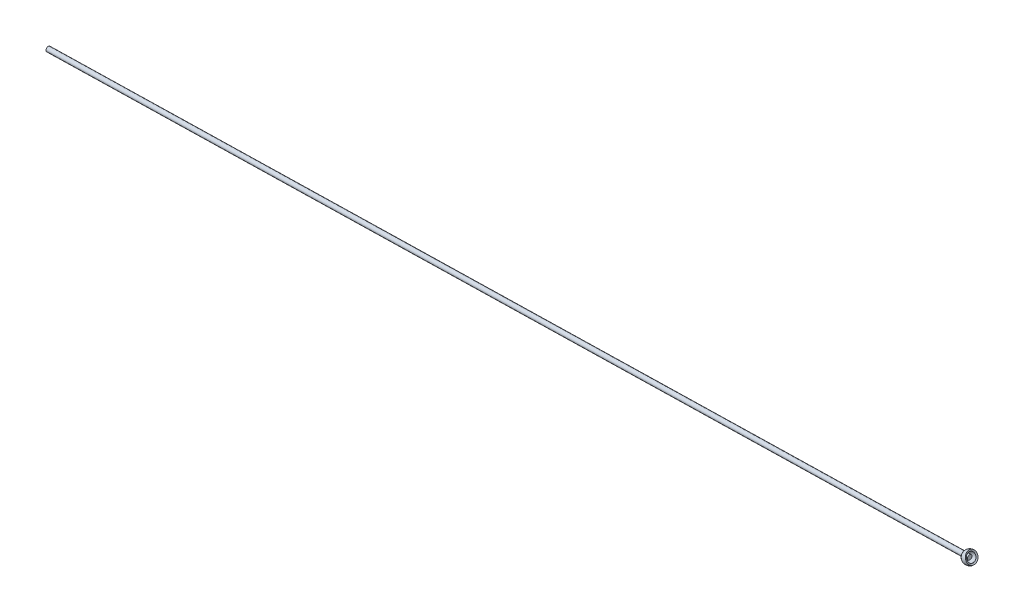
ISO-10303-21;
HEADER;
FILE_DESCRIPTION(('STEP AP214'),'2;1');
FILE_NAME('part.step','',(''),(''),'','','');
FILE_SCHEMA(('AUTOMOTIVE_DESIGN { 1 0 10303 214 1 1 1 1 }'));
ENDSEC;
DATA;
#1=APPLICATION_CONTEXT('core data for automotive mechanical design processes');
#2=APPLICATION_PROTOCOL_DEFINITION('international standard','automotive_design',2000,#1);
#3=PRODUCT_CONTEXT('',#1,'mechanical');
#4=PRODUCT('Part','Part','',(#3));
#5=PRODUCT_RELATED_PRODUCT_CATEGORY('part','',(#4));
#6=PRODUCT_DEFINITION_FORMATION('','',#4);
#7=PRODUCT_DEFINITION_CONTEXT('part definition',#1,'design');
#8=PRODUCT_DEFINITION('design','',#6,#7);
#9=PRODUCT_DEFINITION_SHAPE('','',#8);
#10=(LENGTH_UNIT() NAMED_UNIT(*) SI_UNIT(.MILLI.,.METRE.));
#11=(NAMED_UNIT(*) PLANE_ANGLE_UNIT() SI_UNIT($,.RADIAN.));
#12=(NAMED_UNIT(*) SI_UNIT($,.STERADIAN.) SOLID_ANGLE_UNIT());
#13=UNCERTAINTY_MEASURE_WITH_UNIT(LENGTH_MEASURE(1.E-05),#10,'distance_accuracy_value','');
#14=(GEOMETRIC_REPRESENTATION_CONTEXT(3) GLOBAL_UNCERTAINTY_ASSIGNED_CONTEXT((#13)) GLOBAL_UNIT_ASSIGNED_CONTEXT((#10,
#11,#12)) REPRESENTATION_CONTEXT('',''));
#15=CARTESIAN_POINT('',(0.,0.,0.));
#16=DIRECTION('',(0.,0.,1.));
#17=DIRECTION('',(1.,0.,0.));
#18=AXIS2_PLACEMENT_3D('',#15,#16,#17);
#19=CARTESIAN_POINT('',(-891.012132466336,-167.723171854047,0.));
#20=DIRECTION('',(0.999750901456538,0.0223189389720974,0.));
#21=DIRECTION('',(-0.0223189389720974,0.999750901456538,0.));
#22=AXIS2_PLACEMENT_3D('',#19,#20,#21);
#23=CYLINDRICAL_SURFACE('',#22,1.5);
#24=CARTESIAN_POINT('',(-891.012132466336,-167.723171854047,0.));
#25=DIRECTION('',(0.999750901456538,0.0223189389720974,0.));
#26=DIRECTION('',(-0.0223189389720974,0.999750901456538,0.));
#27=AXIS2_PLACEMENT_3D('',#24,#25,#26);
#28=CIRCLE('',#27,1.5);
#29=CARTESIAN_POINT('',(-891.045610874794,-166.223545501862,0.));
#30=VERTEX_POINT('',#29);
#31=EDGE_CURVE('E39',#30,#30,#28,.T.);
#32=ORIENTED_EDGE('',*,*,#31,.T.);
#33=EDGE_LOOP('',(#32));
#34=FACE_BOUND('',#33,.T.);
#35=CARTESIAN_POINT('',(-294.868767153841,-154.414569311508,0.));
#36=DIRECTION('',(0.999750901456541,0.0223189389720994,0.));
#37=DIRECTION('',(-0.0223189389720993,0.999750901456538,0.));
#38=AXIS2_PLACEMENT_3D('',#35,#36,#37);
#39=CIRCLE('',#38,1.5);
#40=CARTESIAN_POINT('',(-294.902245562299,-152.914942959323,0.));
#41=VERTEX_POINT('',#40);
#42=EDGE_CURVE('E35',#41,#41,#39,.F.);
#43=ORIENTED_EDGE('',*,*,#42,.T.);
#44=EDGE_LOOP('',(#43));
#45=FACE_BOUND('',#44,.T.);
#46=ADVANCED_FACE('F31',(#34,#45),#23,.T.);
#47=CARTESIAN_POINT('',(-891.012132466336,-167.723171854047,0.));
#48=DIRECTION('',(0.999750901456538,0.0223189389720974,0.));
#49=DIRECTION('',(-0.0223189389720974,0.999750901456538,0.));
#50=AXIS2_PLACEMENT_3D('',#47,#48,#49);
#51=PLANE('',#50);
#52=ORIENTED_EDGE('',*,*,#31,.F.);
#53=EDGE_LOOP('',(#52));
#54=FACE_BOUND('',#53,.T.);
#55=ADVANCED_FACE('F70',(#54),#51,.F.);
#56=CARTESIAN_POINT('',(-291.161591592414,-154.331808470789,0.));
#57=DIRECTION('',(-0.892973188253534,-0.450109858879273,0.));
#58=DIRECTION('',(-0.450109858879273,0.892973188253534,0.));
#59=AXIS2_PLACEMENT_3D('',#56,#57,#58);
#60=SPHERICAL_SURFACE('',#59,3.99999999999998);
#61=ORIENTED_EDGE('',*,*,#42,.F.);
#62=EDGE_LOOP('',(#61));
#63=FACE_BOUND('',#62,.T.);
#64=CARTESIAN_POINT('',(-289.939932321084,-153.716021917004,0.));
#65=DIRECTION('',(-0.892973188253534,-0.450109858879273,0.));
#66=DIRECTION('',(0.450109858879273,-0.892973188253534,0.));
#67=AXIS2_PLACEMENT_3D('',#64,#65,#66);
#68=CIRCLE('',#67,3.75877048314366);
#69=CARTESIAN_POINT('',(-291.631791972811,-150.359540654758,0.));
#70=VERTEX_POINT('',#69);
#71=EDGE_CURVE('E51',#70,#70,#68,.T.);
#72=ORIENTED_EDGE('',*,*,#71,.T.);
#73=EDGE_LOOP('',(#72));
#74=FACE_BOUND('',#73,.T.);
#75=ADVANCED_FACE('F55',(#63,#74),#60,.T.);
#76=CARTESIAN_POINT('',(-291.161591592414,-154.331808470789,0.));
#77=DIRECTION('',(-0.892973188253534,-0.450109858879273,0.));
#78=DIRECTION('',(-0.450109858879273,0.892973188253534,0.));
#79=AXIS2_PLACEMENT_3D('',#76,#77,#78);
#80=SPHERICAL_SURFACE('',#79,2.99999999999998);
#81=CARTESIAN_POINT('',(-293.759020626767,-154.389794775195,0.));
#82=DIRECTION('',(0.999750901456531,0.0223189389721026,0.));
#83=DIRECTION('',(-0.0223189389721028,0.999750901456538,0.));
#84=AXIS2_PLACEMENT_3D('',#81,#82,#83);
#85=CIRCLE('',#84,1.5);
#86=CARTESIAN_POINT('',(-293.792499035225,-152.89016842301,0.));
#87=VERTEX_POINT('',#86);
#88=EDGE_CURVE('E10',#87,#87,#85,.F.);
#89=CARTESIAN_POINT('',(-290.245347138916,-153.86996855545,0.));
#90=DIRECTION('',(-0.892973188253534,-0.450109858879273,0.));
#91=DIRECTION('',(0.450109858879273,-0.892973188253534,0.));
#92=AXIS2_PLACEMENT_3D('',#89,#90,#91);
#93=CIRCLE('',#92,2.81907786235773);
#94=CARTESIAN_POINT('',(-291.514241877712,-151.352607608765,0.));
#95=VERTEX_POINT('',#94);
#96=EDGE_CURVE('E48',#95,#95,#93,.T.);
#97=CARTESIAN_POINT('',(-293.792499035225,-152.89016842301,0.));
#98=CARTESIAN_POINT('',(-293.778207460315,-152.864086855634,0.));
#99=CARTESIAN_POINT('',(-293.763527808711,-152.838217948194,0.));
#100=CARTESIAN_POINT('',(-293.733405867227,-152.786928020059,0.));
#101=CARTESIAN_POINT('',(-293.717963577348,-152.761506999363,0.));
#102=CARTESIAN_POINT('',(-293.686329874428,-152.711135411587,0.));
#103=CARTESIAN_POINT('',(-293.670138461388,-152.686184844507,0.));
#104=CARTESIAN_POINT('',(-293.63702087054,-152.636776208606,0.));
#105=CARTESIAN_POINT('',(-293.620094692733,-152.612318139786,0.));
#106=CARTESIAN_POINT('',(-293.585522532169,-152.563916137912,0.));
#107=CARTESIAN_POINT('',(-293.567876549412,-152.539972204858,0.));
#108=CARTESIAN_POINT('',(-293.531880388358,-152.492619649681,0.));
#109=CARTESIAN_POINT('',(-293.513530210062,-152.469211027559,0.));
#110=CARTESIAN_POINT('',(-293.476141886678,-152.422949798008,0.));
#111=CARTESIAN_POINT('',(-293.45710374159,-152.40009719058,0.));
#112=CARTESIAN_POINT('',(-293.418356322761,-152.354968201875,0.));
#113=CARTESIAN_POINT('',(-293.39864704902,-152.332691820598,0.));
#114=CARTESIAN_POINT('',(-293.35857480434,-152.288734986169,0.));
#115=CARTESIAN_POINT('',(-293.338211833402,-152.267054533016,0.));
#116=CARTESIAN_POINT('',(-293.296850204003,-152.224308729709,0.));
#117=CARTESIAN_POINT('',(-293.275851545542,-152.203243379555,0.));
#118=CARTESIAN_POINT('',(-293.233237112975,-152.161746413114,0.));
#119=CARTESIAN_POINT('',(-293.211621338869,-152.141314796826,0.));
#120=CARTESIAN_POINT('',(-293.167791792693,-152.10110336849,0.));
#121=CARTESIAN_POINT('',(-293.145578020622,-152.081323556441,0.));
#122=CARTESIAN_POINT('',(-293.100572125083,-152.042433230477,0.));
#123=CARTESIAN_POINT('',(-293.077780001615,-152.023322716562,0.));
#124=CARTESIAN_POINT('',(-293.031637561359,-151.985787888813,0.));
#125=CARTESIAN_POINT('',(-293.008287244573,-151.967363574979,0.));
#126=CARTESIAN_POINT('',(-292.961049069445,-151.931217442442,0.));
#127=CARTESIAN_POINT('',(-292.937161211103,-151.913495623738,0.));
#128=CARTESIAN_POINT('',(-292.888869080048,-151.878770155203,0.));
#129=CARTESIAN_POINT('',(-292.864464807334,-151.86176650537,0.));
#130=CARTESIAN_POINT('',(-292.815161431451,-151.828492413147,0.));
#131=CARTESIAN_POINT('',(-292.790262328281,-151.812221970755,0.));
#132=CARTESIAN_POINT('',(-292.739991313043,-151.780428683509,0.));
#133=CARTESIAN_POINT('',(-292.714619400976,-151.764905838655,0.));
#134=CARTESIAN_POINT('',(-292.663425207672,-151.734621475383,0.));
#135=CARTESIAN_POINT('',(-292.637602926435,-151.719859956965,0.));
#136=CARTESIAN_POINT('',(-292.585530832838,-151.691111302122,0.));
#137=CARTESIAN_POINT('',(-292.559281020478,-151.677124165697,0.));
#138=CARTESIAN_POINT('',(-292.506377080806,-151.649936645508,0.));
#139=CARTESIAN_POINT('',(-292.479722953493,-151.636736261745,0.));
#140=CARTESIAN_POINT('',(-292.426033957674,-151.611133921719,0.));
#141=CARTESIAN_POINT('',(-292.398999089168,-151.598731965456,0.));
#142=CARTESIAN_POINT('',(-292.344572521459,-151.574737449118,0.));
#143=CARTESIAN_POINT('',(-292.317180822257,-151.563144889043,0.));
#144=CARTESIAN_POINT('',(-292.262064819248,-151.540779417904,0.));
#145=CARTESIAN_POINT('',(-292.234340515442,-151.53000650684,0.));
#146=CARTESIAN_POINT('',(-292.178583823479,-151.509289861647,0.));
#147=CARTESIAN_POINT('',(-292.150551435323,-151.499346127517,0.));
#148=CARTESIAN_POINT('',(-292.094203367407,-151.480296630685,0.));
#149=CARTESIAN_POINT('',(-292.065887687647,-151.471190867984,0.));
#150=CARTESIAN_POINT('',(-292.008998079777,-151.453825367661,0.));
#151=CARTESIAN_POINT('',(-291.980424151667,-151.44556563004,0.));
#152=CARTESIAN_POINT('',(-291.923043318917,-151.42989948421,0.));
#153=CARTESIAN_POINT('',(-291.894236414275,-151.422493076002,0.));
#154=CARTESIAN_POINT('',(-291.836415105736,-151.408540142606,0.));
#155=CARTESIAN_POINT('',(-291.807400701839,-151.401993617418,0.));
#156=CARTESIAN_POINT('',(-291.749190057795,-151.389766228281,0.));
#157=CARTESIAN_POINT('',(-291.719993817649,-151.384085364331,0.));
#158=CARTESIAN_POINT('',(-291.66144531668,-151.373594365817,0.));
#159=CARTESIAN_POINT('',(-291.632093055858,-151.368784231253,0.));
#160=CARTESIAN_POINT('',(-291.573258497914,-151.36003878224,0.));
#161=CARTESIAN_POINT('',(-291.543776200793,-151.356103467791,0.));
#162=CARTESIAN_POINT('',(-291.514241877712,-151.352607608765,0.));
#163=B_SPLINE_CURVE_WITH_KNOTS('',3,(#97,#98,#99,#100,#101,#102,#103,#104,#105,#106,#107,#108,
#109,#110,#111,#112,#113,#114,#115,#116,#117,#118,#119,#120,#121,#122,#123,#124,#125,#126,#127,
#128,#129,#130,#131,#132,#133,#134,#135,#136,#137,#138,#139,#140,#141,#142,#143,#144,#145,#146,
#147,#148,#149,#150,#151,#152,#153,#154,#155,#156,#157,#158,#159,#160,#161,#162),.UNSPECIFIED.,
.F.,.F.,(4,2,2,2,2,2,2,2,2,2,2,2,2,2,2,2,2,2,2,2,2,2,2,2,2,2,2,2,2,2,2,2,4),(0.,
0.0892181961860407,0.178436392372094,0.267654588558128,0.356872784744169,0.446090980930189,
0.535309177116234,0.624527373302305,0.713745569488334,0.802963765674354,0.892181961860428,
0.981400158046458,1.07061835423247,1.15983655041851,1.24905474660456,1.3382729427906,
1.42749113897664,1.51670933516267,1.60592753134873,1.69514572753477,1.78436392372078,
1.87358211990684,1.96280031609288,2.05201851227891,2.14123670846498,2.23045490465101,
2.31967310083705,2.4088912970231,2.4981094932091,2.58732768939518,2.67654588558121,
2.76576408176724,2.85498227795331),.UNSPECIFIED.);
#164=EDGE_CURVE('BSEAM60',#87,#95,#163,.T.);
#165=ORIENTED_EDGE('',*,*,#88,.T.);
#166=ORIENTED_EDGE('',*,*,#96,.F.);
#167=ORIENTED_EDGE('',*,*,#164,.T.);
#168=ORIENTED_EDGE('',*,*,#164,.F.);
#169=EDGE_LOOP('',(#165,#167,#166,#168));
#170=FACE_BOUND('',#169,.T.);
#171=ADVANCED_FACE('F60',(#170),#80,.F.);
#172=CARTESIAN_POINT('',(-289.939932321084,-153.716021917004,0.));
#173=DIRECTION('',(0.892973188253534,0.450109858879273,0.));
#174=DIRECTION('',(-0.450109858879273,0.892973188253534,0.));
#175=AXIS2_PLACEMENT_3D('',#172,#173,#174);
#176=CONICAL_SURFACE('',#175,3.75877048314366,1.22173047639607);
#177=CARTESIAN_POINT('',(-291.514241877712,-151.352607608765,0.));
#178=CARTESIAN_POINT('',(-291.515466357869,-151.342263161328,0.));
#179=CARTESIAN_POINT('',(-291.516690838026,-151.33191871389,0.));
#180=CARTESIAN_POINT('',(-291.519139798341,-151.311229819015,0.));
#181=CARTESIAN_POINT('',(-291.520364278498,-151.300885371578,0.));
#182=CARTESIAN_POINT('',(-291.522813238813,-151.280196476702,0.));
#183=CARTESIAN_POINT('',(-291.52403771897,-151.269852029265,0.));
#184=CARTESIAN_POINT('',(-291.526486679285,-151.24916313439,0.));
#185=CARTESIAN_POINT('',(-291.527711159442,-151.238818686952,0.));
#186=CARTESIAN_POINT('',(-291.530160119756,-151.218129792077,0.));
#187=CARTESIAN_POINT('',(-291.531384599914,-151.207785344639,0.));
#188=CARTESIAN_POINT('',(-291.533833560228,-151.187096449764,0.));
#189=CARTESIAN_POINT('',(-291.535058040386,-151.176752002327,0.));
#190=CARTESIAN_POINT('',(-291.5375070007,-151.156063107451,0.));
#191=CARTESIAN_POINT('',(-291.538731480858,-151.145718660014,0.));
#192=CARTESIAN_POINT('',(-291.541180441172,-151.125029765139,0.));
#193=CARTESIAN_POINT('',(-291.542404921329,-151.114685317701,0.));
#194=CARTESIAN_POINT('',(-291.544853881644,-151.093996422826,0.));
#195=CARTESIAN_POINT('',(-291.546078361801,-151.083651975388,0.));
#196=CARTESIAN_POINT('',(-291.548527322116,-151.062963080513,0.));
#197=CARTESIAN_POINT('',(-291.549751802273,-151.052618633076,0.));
#198=CARTESIAN_POINT('',(-291.552200762588,-151.0319297382,0.));
#199=CARTESIAN_POINT('',(-291.553425242745,-151.021585290763,0.));
#200=CARTESIAN_POINT('',(-291.55587420306,-151.000896395888,0.));
#201=CARTESIAN_POINT('',(-291.557098683217,-150.99055194845,0.));
#202=CARTESIAN_POINT('',(-291.559547643531,-150.969863053575,0.));
#203=CARTESIAN_POINT('',(-291.560772123689,-150.959518606137,0.));
#204=CARTESIAN_POINT('',(-291.563221084003,-150.938829711262,0.));
#205=CARTESIAN_POINT('',(-291.564445564161,-150.928485263825,0.));
#206=CARTESIAN_POINT('',(-291.566894524475,-150.90779636895,0.));
#207=CARTESIAN_POINT('',(-291.568119004632,-150.897451921512,0.));
#208=CARTESIAN_POINT('',(-291.570567964947,-150.876763026637,0.));
#209=CARTESIAN_POINT('',(-291.571792445104,-150.866418579199,0.));
#210=CARTESIAN_POINT('',(-291.574241405419,-150.845729684324,0.));
#211=CARTESIAN_POINT('',(-291.575465885576,-150.835385236886,0.));
#212=CARTESIAN_POINT('',(-291.577914845891,-150.814696342011,0.));
#213=CARTESIAN_POINT('',(-291.579139326048,-150.804351894574,0.));
#214=CARTESIAN_POINT('',(-291.581588286362,-150.783662999699,0.));
#215=CARTESIAN_POINT('',(-291.58281276652,-150.773318552261,0.));
#216=CARTESIAN_POINT('',(-291.585261726834,-150.752629657386,0.));
#217=CARTESIAN_POINT('',(-291.586486206992,-150.742285209948,0.));
#218=CARTESIAN_POINT('',(-291.588935167306,-150.721596315073,0.));
#219=CARTESIAN_POINT('',(-291.590159647464,-150.711251867635,0.));
#220=CARTESIAN_POINT('',(-291.592608607778,-150.69056297276,0.));
#221=CARTESIAN_POINT('',(-291.593833087935,-150.680218525323,0.));
#222=CARTESIAN_POINT('',(-291.59628204825,-150.659529630448,0.));
#223=CARTESIAN_POINT('',(-291.597506528407,-150.64918518301,0.));
#224=CARTESIAN_POINT('',(-291.599955488722,-150.628496288135,0.));
#225=CARTESIAN_POINT('',(-291.601179968879,-150.618151840697,0.));
#226=CARTESIAN_POINT('',(-291.603628929194,-150.597462945822,0.));
#227=CARTESIAN_POINT('',(-291.604853409351,-150.587118498385,0.));
#228=CARTESIAN_POINT('',(-291.607302369665,-150.566429603509,0.));
#229=CARTESIAN_POINT('',(-291.608526849823,-150.556085156072,0.));
#230=CARTESIAN_POINT('',(-291.610975810137,-150.535396261197,0.));
#231=CARTESIAN_POINT('',(-291.612200290295,-150.525051813759,0.));
#232=CARTESIAN_POINT('',(-291.614649250609,-150.504362918884,0.));
#233=CARTESIAN_POINT('',(-291.615873730767,-150.494018471446,0.));
#234=CARTESIAN_POINT('',(-291.618322691081,-150.473329576571,0.));
#235=CARTESIAN_POINT('',(-291.619547171238,-150.462985129134,0.));
#236=CARTESIAN_POINT('',(-291.621996131553,-150.442296234258,0.));
#237=CARTESIAN_POINT('',(-291.62322061171,-150.431951786821,0.));
#238=CARTESIAN_POINT('',(-291.625669572025,-150.411262891946,0.));
#239=CARTESIAN_POINT('',(-291.626894052182,-150.400918444508,0.));
#240=CARTESIAN_POINT('',(-291.629343012497,-150.380229549633,0.));
#241=CARTESIAN_POINT('',(-291.630567492654,-150.369885102195,0.));
#242=CARTESIAN_POINT('',(-291.631791972811,-150.359540654758,0.));
#243=B_SPLINE_CURVE_WITH_KNOTS('',3,(#177,#178,#179,#180,#181,#182,#183,#184,#185,#186,#187,
#188,#189,#190,#191,#192,#193,#194,#195,#196,#197,#198,#199,#200,#201,#202,#203,#204,#205,#206,
#207,#208,#209,#210,#211,#212,#213,#214,#215,#216,#217,#218,#219,#220,#221,#222,#223,#224,#225,
#226,#227,#228,#229,#230,#231,#232,#233,#234,#235,#236,#237,#238,#239,#240,#241,#242),
.UNSPECIFIED.,.F.,.F.,(4,2,2,2,2,2,2,2,2,2,2,2,2,2,2,2,2,2,2,2,2,2,2,2,2,2,2,2,2,2,2,2,4),(0.,
0.0312500000000076,0.0624999999999877,0.0937499999999612,0.124999999999996,0.156249999999976,
0.187499999999984,0.218749999999964,0.249999999999972,0.281249999999973,0.312499999999953,
0.343749999999939,0.374999999999975,0.406249999999955,0.437499999999956,0.468749999999936,
0.499999999999944,0.531249999999951,0.562499999999931,0.593749999999932,0.62499999999994,
0.65624999999992,0.687499999999928,0.718749999999914,0.749999999999915,0.781249999999923,
0.812499999999903,0.843749999999911,0.874999999999918,0.906249999999898,0.937499999999899,
0.968749999999907,0.999999999999887),.UNSPECIFIED.);
#244=EDGE_CURVE('BSEAM57',#95,#70,#243,.T.);
#245=ORIENTED_EDGE('',*,*,#96,.T.);
#246=ORIENTED_EDGE('',*,*,#71,.F.);
#247=ORIENTED_EDGE('',*,*,#244,.T.);
#248=ORIENTED_EDGE('',*,*,#244,.F.);
#249=EDGE_LOOP('',(#245,#247,#246,#248));
#250=FACE_BOUND('',#249,.T.);
#251=ADVANCED_FACE('F57',(#250),#176,.F.);
#252=CARTESIAN_POINT('',(-291.161591592414,-154.331808470789,0.));
#253=DIRECTION('',(0.999750901456538,0.0223189389720974,0.));
#254=DIRECTION('',(-0.0223189389720974,0.999750901456538,0.));
#255=AXIS2_PLACEMENT_3D('',#252,#253,#254);
#256=PLANE('',#255);
#257=CARTESIAN_POINT('',(-291.161591592414,-154.331808470789,0.));
#258=DIRECTION('',(0.999750901456538,0.0223189389720974,0.));
#259=DIRECTION('',(-0.0223189389720974,0.999750901456538,0.));
#260=AXIS2_PLACEMENT_3D('',#257,#258,#259);
#261=CIRCLE('',#260,1.5);
#262=CARTESIAN_POINT('',(-291.195070000872,-152.832182118604,0.));
#263=VERTEX_POINT('',#262);
#264=EDGE_CURVE('E43',#263,#263,#261,.T.);
#265=ORIENTED_EDGE('',*,*,#264,.T.);
#266=EDGE_LOOP('',(#265));
#267=FACE_BOUND('',#266,.T.);
#268=ADVANCED_FACE('F59',(#267),#256,.T.);
#269=ORIENTED_EDGE('',*,*,#88,.F.);
#270=EDGE_LOOP('',(#269));
#271=FACE_BOUND('',#270,.T.);
#272=ORIENTED_EDGE('',*,*,#264,.F.);
#273=EDGE_LOOP('',(#272));
#274=FACE_BOUND('',#273,.T.);
#275=ADVANCED_FACE('F33',(#271,#274),#23,.T.);
#276=CLOSED_SHELL('',(#46,#55,#75,#171,#251,#268,#275));
#277=MANIFOLD_SOLID_BREP('B2',#276);
#278=ADVANCED_BREP_SHAPE_REPRESENTATION('',(#18,#277),#14);
#279=SHAPE_DEFINITION_REPRESENTATION(#9,#278);
ENDSEC;
END-ISO-10303-21;
